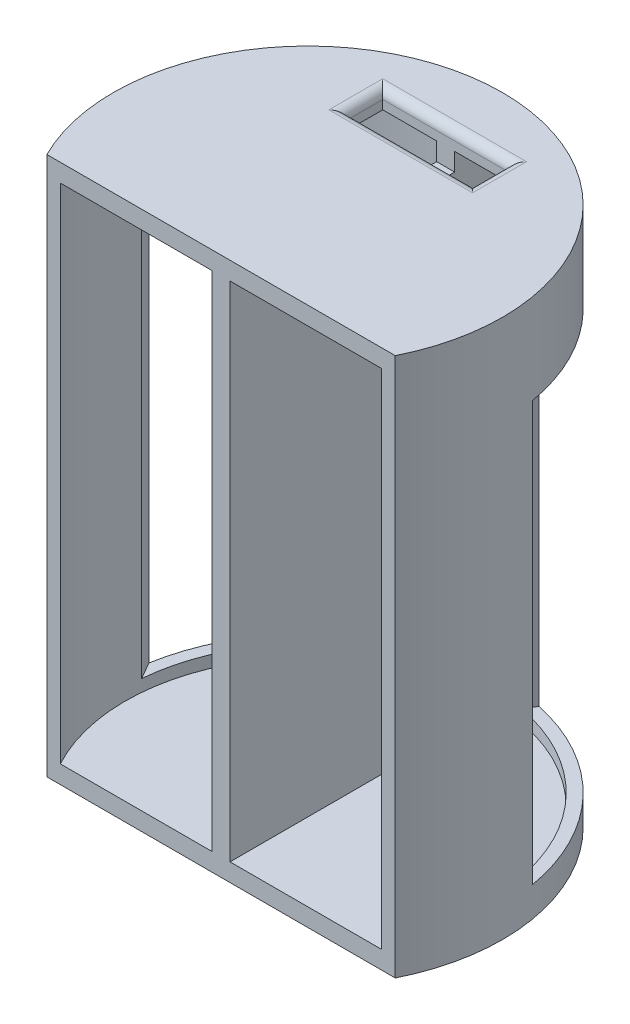
ISO-10303-21;
HEADER;
FILE_DESCRIPTION(('STEP AP214'),'2;1');
FILE_NAME('part.step','',(''),(''),'','','');
FILE_SCHEMA(('AUTOMOTIVE_DESIGN { 1 0 10303 214 1 1 1 1 }'));
ENDSEC;
DATA;
#1=APPLICATION_CONTEXT('core data for automotive mechanical design processes');
#2=APPLICATION_PROTOCOL_DEFINITION('international standard','automotive_design',2000,#1);
#3=PRODUCT_CONTEXT('',#1,'mechanical');
#4=PRODUCT('Part','Part','',(#3));
#5=PRODUCT_RELATED_PRODUCT_CATEGORY('part','',(#4));
#6=PRODUCT_DEFINITION_FORMATION('','',#4);
#7=PRODUCT_DEFINITION_CONTEXT('part definition',#1,'design');
#8=PRODUCT_DEFINITION('design','',#6,#7);
#9=PRODUCT_DEFINITION_SHAPE('','',#8);
#10=(LENGTH_UNIT() NAMED_UNIT(*) SI_UNIT(.MILLI.,.METRE.));
#11=(NAMED_UNIT(*) PLANE_ANGLE_UNIT() SI_UNIT($,.RADIAN.));
#12=(NAMED_UNIT(*) SI_UNIT($,.STERADIAN.) SOLID_ANGLE_UNIT());
#13=UNCERTAINTY_MEASURE_WITH_UNIT(LENGTH_MEASURE(1.E-05),#10,'distance_accuracy_value','');
#14=(GEOMETRIC_REPRESENTATION_CONTEXT(3) GLOBAL_UNCERTAINTY_ASSIGNED_CONTEXT((#13)) GLOBAL_UNIT_ASSIGNED_CONTEXT((#10,
#11,#12)) REPRESENTATION_CONTEXT('',''));
#15=CARTESIAN_POINT('',(0.,0.,0.));
#16=DIRECTION('',(0.,0.,1.));
#17=DIRECTION('',(1.,0.,0.));
#18=AXIS2_PLACEMENT_3D('',#15,#16,#17);
#19=CARTESIAN_POINT('',(0.,0.,0.));
#20=DIRECTION('',(0.,1.,0.));
#21=DIRECTION('',(0.,0.,1.));
#22=AXIS2_PLACEMENT_3D('',#19,#20,#21);
#23=PLANE('',#22);
#24=DIRECTION('',(0.,0.,-1.));
#25=VECTOR('',#24,1.);
#26=CARTESIAN_POINT('',(-11.,0.,-17.5));
#27=LINE('',#26,#25);
#28=CARTESIAN_POINT('',(-11.,0.,-23.5));
#29=VERTEX_POINT('',#28);
#30=CARTESIAN_POINT('',(-11.,0.,-16.5));
#31=VERTEX_POINT('',#30);
#32=EDGE_CURVE('E555',#29,#31,#27,.F.);
#33=ORIENTED_EDGE('',*,*,#32,.T.);
#34=DIRECTION('',(-1.,0.,0.));
#35=VECTOR('',#34,1.);
#36=CARTESIAN_POINT('',(10.,0.,-16.5));
#37=LINE('',#36,#35);
#38=CARTESIAN_POINT('',(11.,0.,-16.5));
#39=VERTEX_POINT('',#38);
#40=EDGE_CURVE('E561',#31,#39,#37,.F.);
#41=ORIENTED_EDGE('',*,*,#40,.T.);
#42=DIRECTION('',(0.,0.,1.));
#43=VECTOR('',#42,1.);
#44=CARTESIAN_POINT('',(11.,0.,-22.5));
#45=LINE('',#44,#43);
#46=CARTESIAN_POINT('',(11.,0.,-23.5));
#47=VERTEX_POINT('',#46);
#48=EDGE_CURVE('E558',#39,#47,#45,.F.);
#49=ORIENTED_EDGE('',*,*,#48,.T.);
#50=DIRECTION('',(1.,0.,0.));
#51=VECTOR('',#50,1.);
#52=CARTESIAN_POINT('',(-10.,0.,-23.5));
#53=LINE('',#52,#51);
#54=EDGE_CURVE('E552',#47,#29,#53,.F.);
#55=ORIENTED_EDGE('',*,*,#54,.T.);
#56=EDGE_LOOP('',(#33,#41,#49,#55));
#57=FACE_BOUND('',#56,.T.);
#58=CARTESIAN_POINT('',(0.,0.,0.));
#59=DIRECTION('',(0.,1.,0.));
#60=DIRECTION('',(0.,0.,1.));
#61=AXIS2_PLACEMENT_3D('',#58,#59,#60);
#62=CIRCLE('',#61,32.5);
#63=CARTESIAN_POINT('',(29.086079144498,0.,14.5));
#64=VERTEX_POINT('',#63);
#65=CARTESIAN_POINT('',(-29.086079144498,0.,14.5));
#66=VERTEX_POINT('',#65);
#67=EDGE_CURVE('E457',#64,#66,#62,.T.);
#68=ORIENTED_EDGE('',*,*,#67,.F.);
#69=DIRECTION('',(-1.,0.,0.));
#70=VECTOR('',#69,1.);
#71=CARTESIAN_POINT('',(-29.086079144498,0.,14.5));
#72=LINE('',#71,#70);
#73=EDGE_CURVE('E419',#64,#66,#72,.T.);
#74=ORIENTED_EDGE('',*,*,#73,.T.);
#75=EDGE_LOOP('',(#68,#74));
#76=FACE_BOUND('',#75,.T.);
#77=ADVANCED_FACE('F39',(#57,#76),#23,.F.);
#78=CARTESIAN_POINT('',(0.,87.,0.));
#79=DIRECTION('',(0.,1.,0.));
#80=DIRECTION('',(0.,0.,1.));
#81=AXIS2_PLACEMENT_3D('',#78,#79,#80);
#82=PLANE('',#81);
#83=DIRECTION('',(-1.,0.,0.));
#84=VECTOR('',#83,1.);
#85=CARTESIAN_POINT('',(0.,87.,-17.));
#86=LINE('',#85,#84);
#87=CARTESIAN_POINT('',(10.5,87.,-17.));
#88=VERTEX_POINT('',#87);
#89=CARTESIAN_POINT('',(1.49999999999998,87.,-17.));
#90=VERTEX_POINT('',#89);
#91=EDGE_CURVE('E320',#88,#90,#86,.T.);
#92=ORIENTED_EDGE('',*,*,#91,.F.);
#93=DIRECTION('',(0.,0.,1.));
#94=VECTOR('',#93,1.);
#95=CARTESIAN_POINT('',(10.5,87.,0.));
#96=LINE('',#95,#94);
#97=CARTESIAN_POINT('',(10.5,87.,-23.));
#98=VERTEX_POINT('',#97);
#99=EDGE_CURVE('E323',#98,#88,#96,.T.);
#100=ORIENTED_EDGE('',*,*,#99,.F.);
#101=DIRECTION('',(1.,0.,0.));
#102=VECTOR('',#101,1.);
#103=CARTESIAN_POINT('',(0.,87.,-23.));
#104=LINE('',#103,#102);
#105=CARTESIAN_POINT('',(1.49999999999998,87.,-23.));
#106=VERTEX_POINT('',#105);
#107=EDGE_CURVE('E308',#106,#98,#104,.T.);
#108=ORIENTED_EDGE('',*,*,#107,.F.);
#109=DIRECTION('',(0.,0.,1.));
#110=VECTOR('',#109,1.);
#111=CARTESIAN_POINT('',(1.49999999999998,87.,-32.502));
#112=LINE('',#111,#110);
#113=CARTESIAN_POINT('',(1.49999999999998,87.,-30.4630924234556));
#114=VERTEX_POINT('',#113);
#115=EDGE_CURVE('E334',#114,#106,#112,.T.);
#116=ORIENTED_EDGE('',*,*,#115,.F.);
#117=CARTESIAN_POINT('',(0.,87.,0.));
#118=DIRECTION('',(0.,1.,0.));
#119=DIRECTION('',(0.,0.,1.));
#120=AXIS2_PLACEMENT_3D('',#117,#118,#119);
#121=CIRCLE('',#120,30.5);
#122=CARTESIAN_POINT('',(26.8328157299975,87.,14.5));
#123=VERTEX_POINT('',#122);
#124=EDGE_CURVE('E461',#123,#114,#121,.T.);
#125=ORIENTED_EDGE('',*,*,#124,.F.);
#126=DIRECTION('',(-1.,0.,0.));
#127=VECTOR('',#126,1.);
#128=CARTESIAN_POINT('',(0.,87.,14.5));
#129=LINE('',#128,#127);
#130=CARTESIAN_POINT('',(1.5,87.,14.5));
#131=VERTEX_POINT('',#130);
#132=EDGE_CURVE('E439',#123,#131,#129,.T.);
#133=ORIENTED_EDGE('',*,*,#132,.T.);
#134=EDGE_CURVE('E339',#90,#131,#112,.T.);
#135=ORIENTED_EDGE('',*,*,#134,.F.);
#136=EDGE_LOOP('',(#92,#100,#108,#116,#125,#133,#135));
#137=FACE_BOUND('',#136,.T.);
#138=ADVANCED_FACE('F622',(#137),#82,.F.);
#139=CARTESIAN_POINT('',(0.,90.,0.));
#140=DIRECTION('',(0.,1.,0.));
#141=DIRECTION('',(0.,0.,1.));
#142=AXIS2_PLACEMENT_3D('',#139,#140,#141);
#143=PLANE('',#142);
#144=DIRECTION('',(0.,0.,1.));
#145=VECTOR('',#144,1.);
#146=CARTESIAN_POINT('',(12.,90.,0.));
#147=LINE('',#146,#145);
#148=CARTESIAN_POINT('',(12.,90.,-24.5));
#149=VERTEX_POINT('',#148);
#150=CARTESIAN_POINT('',(12.,90.,-15.5));
#151=VERTEX_POINT('',#150);
#152=EDGE_CURVE('E519',#149,#151,#147,.T.);
#153=ORIENTED_EDGE('',*,*,#152,.T.);
#154=DIRECTION('',(-1.,0.,0.));
#155=VECTOR('',#154,1.);
#156=CARTESIAN_POINT('',(0.,90.,-15.5));
#157=LINE('',#156,#155);
#158=CARTESIAN_POINT('',(-12.,90.,-15.5));
#159=VERTEX_POINT('',#158);
#160=EDGE_CURVE('E522',#151,#159,#157,.T.);
#161=ORIENTED_EDGE('',*,*,#160,.T.);
#162=DIRECTION('',(0.,0.,-1.));
#163=VECTOR('',#162,1.);
#164=CARTESIAN_POINT('',(-12.,90.,0.));
#165=LINE('',#164,#163);
#166=CARTESIAN_POINT('',(-12.,90.,-24.5));
#167=VERTEX_POINT('',#166);
#168=EDGE_CURVE('E516',#159,#167,#165,.T.);
#169=ORIENTED_EDGE('',*,*,#168,.T.);
#170=DIRECTION('',(1.,0.,0.));
#171=VECTOR('',#170,1.);
#172=CARTESIAN_POINT('',(0.,90.,-24.5));
#173=LINE('',#172,#171);
#174=EDGE_CURVE('E513',#167,#149,#173,.T.);
#175=ORIENTED_EDGE('',*,*,#174,.T.);
#176=EDGE_LOOP('',(#153,#161,#169,#175));
#177=FACE_BOUND('',#176,.T.);
#178=DIRECTION('',(-1.,0.,0.));
#179=VECTOR('',#178,1.);
#180=CARTESIAN_POINT('',(0.,90.,14.5));
#181=LINE('',#180,#179);
#182=CARTESIAN_POINT('',(29.086079144498,90.,14.5));
#183=VERTEX_POINT('',#182);
#184=CARTESIAN_POINT('',(-29.086079144498,90.,14.5));
#185=VERTEX_POINT('',#184);
#186=EDGE_CURVE('E443',#183,#185,#181,.T.);
#187=ORIENTED_EDGE('',*,*,#186,.F.);
#188=CARTESIAN_POINT('',(0.,90.,0.));
#189=DIRECTION('',(0.,1.,0.));
#190=DIRECTION('',(0.,0.,1.));
#191=AXIS2_PLACEMENT_3D('',#188,#189,#190);
#192=CIRCLE('',#191,32.5);
#193=EDGE_CURVE('E452',#183,#185,#192,.T.);
#194=ORIENTED_EDGE('',*,*,#193,.T.);
#195=EDGE_LOOP('',(#187,#194));
#196=FACE_BOUND('',#195,.T.);
#197=ADVANCED_FACE('F627',(#177,#196),#143,.T.);
#198=DIRECTION('',(-1.,0.,0.));
#199=VECTOR('',#198,1.);
#200=CARTESIAN_POINT('',(0.,87.,-17.));
#201=LINE('',#200,#199);
#202=CARTESIAN_POINT('',(-1.50000000000001,87.,-17.));
#203=VERTEX_POINT('',#202);
#204=CARTESIAN_POINT('',(-10.5,87.,-17.));
#205=VERTEX_POINT('',#204);
#206=EDGE_CURVE('E312',#203,#205,#201,.T.);
#207=ORIENTED_EDGE('',*,*,#206,.F.);
#208=DIRECTION('',(0.,0.,-1.));
#209=VECTOR('',#208,1.);
#210=CARTESIAN_POINT('',(-1.50000000000001,87.,-32.502));
#211=LINE('',#210,#209);
#212=CARTESIAN_POINT('',(-1.50000000000001,87.,14.5));
#213=VERTEX_POINT('',#212);
#214=EDGE_CURVE('E328',#213,#203,#211,.T.);
#215=ORIENTED_EDGE('',*,*,#214,.F.);
#216=CARTESIAN_POINT('',(-26.8328157299975,87.,14.5));
#217=VERTEX_POINT('',#216);
#218=EDGE_CURVE('E438',#213,#217,#129,.T.);
#219=ORIENTED_EDGE('',*,*,#218,.T.);
#220=CARTESIAN_POINT('',(-1.50000000000001,87.,-30.4630924234556));
#221=VERTEX_POINT('',#220);
#222=EDGE_CURVE('E451',#221,#217,#121,.T.);
#223=ORIENTED_EDGE('',*,*,#222,.F.);
#224=CARTESIAN_POINT('',(-1.50000000000001,87.,-23.));
#225=VERTEX_POINT('',#224);
#226=EDGE_CURVE('E333',#225,#221,#211,.T.);
#227=ORIENTED_EDGE('',*,*,#226,.F.);
#228=DIRECTION('',(1.,0.,0.));
#229=VECTOR('',#228,1.);
#230=CARTESIAN_POINT('',(0.,87.,-23.));
#231=LINE('',#230,#229);
#232=CARTESIAN_POINT('',(-10.5,87.,-23.));
#233=VERTEX_POINT('',#232);
#234=EDGE_CURVE('E301',#233,#225,#231,.T.);
#235=ORIENTED_EDGE('',*,*,#234,.F.);
#236=DIRECTION('',(0.,0.,-1.));
#237=VECTOR('',#236,1.);
#238=CARTESIAN_POINT('',(-10.5,87.,0.));
#239=LINE('',#238,#237);
#240=EDGE_CURVE('E509',#205,#233,#239,.T.);
#241=ORIENTED_EDGE('',*,*,#240,.F.);
#242=EDGE_LOOP('',(#207,#215,#219,#223,#227,#235,#241));
#243=FACE_BOUND('',#242,.T.);
#244=ADVANCED_FACE('F630',(#243),#82,.F.);
#245=CARTESIAN_POINT('',(1.49999999999998,90.,-32.502));
#246=DIRECTION('',(1.,0.,0.));
#247=DIRECTION('',(0.,1.,0.));
#248=AXIS2_PLACEMENT_3D('',#245,#246,#247);
#249=PLANE('',#248);
#250=DIRECTION('',(0.,0.,1.));
#251=VECTOR('',#250,1.);
#252=CARTESIAN_POINT('',(1.49999999999998,84.,-32.502));
#253=LINE('',#252,#251);
#254=CARTESIAN_POINT('',(1.49999999999997,84.,-23.));
#255=VERTEX_POINT('',#254);
#256=CARTESIAN_POINT('',(1.49999999999998,84.,-17.));
#257=VERTEX_POINT('',#256);
#258=EDGE_CURVE('E297',#255,#257,#253,.T.);
#259=ORIENTED_EDGE('',*,*,#258,.T.);
#260=DIRECTION('',(0.,1.,0.));
#261=VECTOR('',#260,1.);
#262=CARTESIAN_POINT('',(1.49999999999998,90.,-17.));
#263=LINE('',#262,#261);
#264=EDGE_CURVE('E316',#257,#90,#263,.T.);
#265=ORIENTED_EDGE('',*,*,#264,.T.);
#266=ORIENTED_EDGE('',*,*,#134,.T.);
#267=DIRECTION('',(0.,1.,0.));
#268=VECTOR('',#267,1.);
#269=CARTESIAN_POINT('',(1.49999999999998,90.,14.5));
#270=LINE('',#269,#268);
#271=CARTESIAN_POINT('',(1.5,3.00000000000003,14.5));
#272=VERTEX_POINT('',#271);
#273=EDGE_CURVE('E346',#272,#131,#270,.T.);
#274=ORIENTED_EDGE('',*,*,#273,.F.);
#275=DIRECTION('',(0.,0.,-1.));
#276=VECTOR('',#275,1.);
#277=CARTESIAN_POINT('',(1.5,3.,-32.502));
#278=LINE('',#277,#276);
#279=CARTESIAN_POINT('',(1.5,3.,-30.4630924234556));
#280=VERTEX_POINT('',#279);
#281=EDGE_CURVE('E338',#272,#280,#278,.T.);
#282=ORIENTED_EDGE('',*,*,#281,.T.);
#283=DIRECTION('',(0.,-1.,0.));
#284=VECTOR('',#283,1.);
#285=CARTESIAN_POINT('',(1.49999999999998,90.,-30.4630924234556));
#286=LINE('',#285,#284);
#287=EDGE_CURVE('E327',#114,#280,#286,.T.);
#288=ORIENTED_EDGE('',*,*,#287,.F.);
#289=ORIENTED_EDGE('',*,*,#115,.T.);
#290=DIRECTION('',(0.,-1.,0.));
#291=VECTOR('',#290,1.);
#292=CARTESIAN_POINT('',(1.49999999999998,90.,-23.));
#293=LINE('',#292,#291);
#294=EDGE_CURVE('E304',#106,#255,#293,.T.);
#295=ORIENTED_EDGE('',*,*,#294,.T.);
#296=EDGE_LOOP('',(#259,#265,#266,#274,#282,#288,#289,#295));
#297=FACE_BOUND('',#296,.T.);
#298=ADVANCED_FACE('F814',(#297),#249,.T.);
#299=CARTESIAN_POINT('',(-1.50000000000001,90.,-32.502));
#300=DIRECTION('',(-1.,0.,0.));
#301=DIRECTION('',(0.,-1.,0.));
#302=AXIS2_PLACEMENT_3D('',#299,#300,#301);
#303=PLANE('',#302);
#304=ORIENTED_EDGE('',*,*,#214,.T.);
#305=DIRECTION('',(0.,-1.,0.));
#306=VECTOR('',#305,1.);
#307=CARTESIAN_POINT('',(-1.50000000000001,90.,-17.));
#308=LINE('',#307,#306);
#309=CARTESIAN_POINT('',(-1.50000000000001,84.,-17.));
#310=VERTEX_POINT('',#309);
#311=EDGE_CURVE('E505',#203,#310,#308,.T.);
#312=ORIENTED_EDGE('',*,*,#311,.T.);
#313=DIRECTION('',(0.,0.,-1.));
#314=VECTOR('',#313,1.);
#315=CARTESIAN_POINT('',(-1.50000000000001,84.,-32.502));
#316=LINE('',#315,#314);
#317=CARTESIAN_POINT('',(-1.50000000000001,84.,-23.));
#318=VERTEX_POINT('',#317);
#319=EDGE_CURVE('E497',#310,#318,#316,.T.);
#320=ORIENTED_EDGE('',*,*,#319,.T.);
#321=DIRECTION('',(0.,1.,0.));
#322=VECTOR('',#321,1.);
#323=CARTESIAN_POINT('',(-1.50000000000001,90.,-23.));
#324=LINE('',#323,#322);
#325=EDGE_CURVE('E501',#318,#225,#324,.T.);
#326=ORIENTED_EDGE('',*,*,#325,.T.);
#327=ORIENTED_EDGE('',*,*,#226,.T.);
#328=DIRECTION('',(0.,-1.,0.));
#329=VECTOR('',#328,1.);
#330=CARTESIAN_POINT('',(-1.50000000000001,90.,-30.4630924234556));
#331=LINE('',#330,#329);
#332=CARTESIAN_POINT('',(-1.5,3.,-30.4630924234556));
#333=VERTEX_POINT('',#332);
#334=EDGE_CURVE('E355',#333,#221,#331,.F.);
#335=ORIENTED_EDGE('',*,*,#334,.F.);
#336=DIRECTION('',(0.,0.,1.));
#337=VECTOR('',#336,1.);
#338=CARTESIAN_POINT('',(-1.5,3.,-32.502));
#339=LINE('',#338,#337);
#340=CARTESIAN_POINT('',(-1.50000000000001,3.,14.5));
#341=VERTEX_POINT('',#340);
#342=EDGE_CURVE('E332',#333,#341,#339,.T.);
#343=ORIENTED_EDGE('',*,*,#342,.T.);
#344=DIRECTION('',(0.,-1.,0.));
#345=VECTOR('',#344,1.);
#346=CARTESIAN_POINT('',(-1.50000000000001,90.,14.5));
#347=LINE('',#346,#345);
#348=EDGE_CURVE('E347',#213,#341,#347,.T.);
#349=ORIENTED_EDGE('',*,*,#348,.F.);
#350=EDGE_LOOP('',(#304,#312,#320,#326,#327,#335,#343,#349));
#351=FACE_BOUND('',#350,.T.);
#352=ADVANCED_FACE('F820',(#351),#303,.T.);
#353=CARTESIAN_POINT('',(0.,90.,0.));
#354=DIRECTION('',(0.,-1.,0.));
#355=DIRECTION('',(0.,0.,-1.));
#356=AXIS2_PLACEMENT_3D('',#353,#354,#355);
#357=CYLINDRICAL_SURFACE('',#356,30.5);
#358=ORIENTED_EDGE('',*,*,#287,.T.);
#359=CARTESIAN_POINT('',(0.,3.,0.));
#360=DIRECTION('',(0.,-1.,0.));
#361=DIRECTION('',(0.,0.,-1.));
#362=AXIS2_PLACEMENT_3D('',#359,#360,#361);
#363=CIRCLE('',#362,30.5);
#364=CARTESIAN_POINT('',(26.8328157299975,3.,14.5));
#365=VERTEX_POINT('',#364);
#366=EDGE_CURVE('E446',#280,#365,#363,.T.);
#367=ORIENTED_EDGE('',*,*,#366,.T.);
#368=DIRECTION('',(0.,-1.,0.));
#369=VECTOR('',#368,1.);
#370=CARTESIAN_POINT('',(26.8328157299975,90.,14.5));
#371=LINE('',#370,#369);
#372=EDGE_CURVE('E434',#123,#365,#371,.T.);
#373=ORIENTED_EDGE('',*,*,#372,.F.);
#374=ORIENTED_EDGE('',*,*,#124,.T.);
#375=EDGE_LOOP('',(#358,#367,#373,#374));
#376=FACE_BOUND('',#375,.T.);
#377=CARTESIAN_POINT('',(0.,4.99999999999999,0.));
#378=DIRECTION('',(0.,-1.,0.));
#379=DIRECTION('',(1.,0.,0.));
#380=AXIS2_PLACEMENT_3D('',#377,#378,#379);
#381=CIRCLE('',#380,30.5);
#382=CARTESIAN_POINT('',(5.74677549637944,5.,-29.9537071394212));
#383=VERTEX_POINT('',#382);
#384=CARTESIAN_POINT('',(30.386337699439,5.,-2.63068075137406));
#385=VERTEX_POINT('',#384);
#386=EDGE_CURVE('E478',#383,#385,#381,.T.);
#387=ORIENTED_EDGE('',*,*,#386,.F.);
#388=DIRECTION('',(0.,-1.,0.));
#389=VECTOR('',#388,1.);
#390=CARTESIAN_POINT('',(5.74677549637946,90.,-29.9537071394212));
#391=LINE('',#390,#389);
#392=CARTESIAN_POINT('',(5.74677549637946,75.,-29.9537071394212));
#393=VERTEX_POINT('',#392);
#394=EDGE_CURVE('E468',#393,#383,#391,.T.);
#395=ORIENTED_EDGE('',*,*,#394,.F.);
#396=CARTESIAN_POINT('',(0.,75.,0.));
#397=DIRECTION('',(0.,1.,0.));
#398=DIRECTION('',(0.,0.,1.));
#399=AXIS2_PLACEMENT_3D('',#396,#397,#398);
#400=CIRCLE('',#399,30.5);
#401=CARTESIAN_POINT('',(30.386337699439,75.,-2.63068075137407));
#402=VERTEX_POINT('',#401);
#403=EDGE_CURVE('E471',#402,#393,#400,.T.);
#404=ORIENTED_EDGE('',*,*,#403,.F.);
#405=DIRECTION('',(0.,-1.,0.));
#406=VECTOR('',#405,1.);
#407=CARTESIAN_POINT('',(30.386337699439,90.,-2.63068075137407));
#408=LINE('',#407,#406);
#409=EDGE_CURVE('E475',#385,#402,#408,.F.);
#410=ORIENTED_EDGE('',*,*,#409,.F.);
#411=EDGE_LOOP('',(#387,#395,#404,#410));
#412=FACE_BOUND('',#411,.T.);
#413=ADVANCED_FACE('F827',(#376,#412),#357,.F.);
#414=CARTESIAN_POINT('',(0.,3.,0.));
#415=DIRECTION('',(0.,-1.,0.));
#416=DIRECTION('',(0.,0.,-1.));
#417=AXIS2_PLACEMENT_3D('',#414,#415,#416);
#418=PLANE('',#417);
#419=ORIENTED_EDGE('',*,*,#366,.F.);
#420=ORIENTED_EDGE('',*,*,#281,.F.);
#421=DIRECTION('',(1.,0.,0.));
#422=VECTOR('',#421,1.);
#423=CARTESIAN_POINT('',(0.,3.,14.5));
#424=LINE('',#423,#422);
#425=EDGE_CURVE('E456',#272,#365,#424,.T.);
#426=ORIENTED_EDGE('',*,*,#425,.T.);
#427=EDGE_LOOP('',(#419,#420,#426));
#428=FACE_BOUND('',#427,.T.);
#429=ADVANCED_FACE('F638',(#428),#418,.F.);
#430=CARTESIAN_POINT('',(0.,90.,0.));
#431=DIRECTION('',(0.,-1.,0.));
#432=DIRECTION('',(0.,0.,-1.));
#433=AXIS2_PLACEMENT_3D('',#430,#431,#432);
#434=CYLINDRICAL_SURFACE('',#433,32.5);
#435=ORIENTED_EDGE('',*,*,#67,.T.);
#436=DIRECTION('',(0.,1.,0.));
#437=VECTOR('',#436,1.);
#438=CARTESIAN_POINT('',(-29.086079144498,0.,14.5));
#439=LINE('',#438,#437);
#440=EDGE_CURVE('E424',#66,#185,#439,.T.);
#441=ORIENTED_EDGE('',*,*,#440,.T.);
#442=ORIENTED_EDGE('',*,*,#193,.F.);
#443=DIRECTION('',(0.,1.,0.));
#444=VECTOR('',#443,1.);
#445=CARTESIAN_POINT('',(29.086079144498,0.,14.5));
#446=LINE('',#445,#444);
#447=EDGE_CURVE('E423',#64,#183,#446,.T.);
#448=ORIENTED_EDGE('',*,*,#447,.F.);
#449=EDGE_LOOP('',(#435,#441,#442,#448));
#450=FACE_BOUND('',#449,.T.);
#451=DIRECTION('',(0.,-1.,0.));
#452=VECTOR('',#451,1.);
#453=CARTESIAN_POINT('',(6.80139205822177,90.,-31.7803566070357));
#454=LINE('',#453,#452);
#455=CARTESIAN_POINT('',(6.80139205822177,75.,-31.7803566070357));
#456=VERTEX_POINT('',#455);
#457=CARTESIAN_POINT('',(6.80139205822177,5.,-31.7803566070357));
#458=VERTEX_POINT('',#457);
#459=EDGE_CURVE('E393',#456,#458,#454,.T.);
#460=ORIENTED_EDGE('',*,*,#459,.T.);
#461=CARTESIAN_POINT('',(0.,4.99999999999999,0.));
#462=DIRECTION('',(0.,-1.,0.));
#463=DIRECTION('',(1.,0.,0.));
#464=AXIS2_PLACEMENT_3D('',#461,#462,#463);
#465=CIRCLE('',#464,32.5);
#466=CARTESIAN_POINT('',(32.0339149232585,5.,-5.48436821242277));
#467=VERTEX_POINT('',#466);
#468=EDGE_CURVE('E415',#458,#467,#465,.T.);
#469=ORIENTED_EDGE('',*,*,#468,.T.);
#470=DIRECTION('',(0.,-1.,0.));
#471=VECTOR('',#470,1.);
#472=CARTESIAN_POINT('',(32.0339149232585,90.,-5.48436821242276));
#473=LINE('',#472,#471);
#474=CARTESIAN_POINT('',(32.0339149232585,75.,-5.48436821242276));
#475=VERTEX_POINT('',#474);
#476=EDGE_CURVE('E411',#467,#475,#473,.F.);
#477=ORIENTED_EDGE('',*,*,#476,.T.);
#478=CARTESIAN_POINT('',(0.,75.,0.));
#479=DIRECTION('',(0.,1.,0.));
#480=DIRECTION('',(0.,0.,1.));
#481=AXIS2_PLACEMENT_3D('',#478,#479,#480);
#482=CIRCLE('',#481,32.5);
#483=EDGE_CURVE('E407',#475,#456,#482,.T.);
#484=ORIENTED_EDGE('',*,*,#483,.T.);
#485=EDGE_LOOP('',(#460,#469,#477,#484));
#486=FACE_BOUND('',#485,.T.);
#487=CARTESIAN_POINT('',(0.,4.99999999999999,0.));
#488=DIRECTION('',(0.,1.,0.));
#489=DIRECTION('',(-1.,0.,0.));
#490=AXIS2_PLACEMENT_3D('',#487,#488,#489);
#491=CIRCLE('',#490,32.5);
#492=CARTESIAN_POINT('',(-6.80139205822176,5.,-31.7803566070357));
#493=VERTEX_POINT('',#492);
#494=CARTESIAN_POINT('',(-32.0339149232585,5.,-5.48436821242276));
#495=VERTEX_POINT('',#494);
#496=EDGE_CURVE('E384',#493,#495,#491,.T.);
#497=ORIENTED_EDGE('',*,*,#496,.F.);
#498=DIRECTION('',(0.,-1.,0.));
#499=VECTOR('',#498,1.);
#500=CARTESIAN_POINT('',(-6.80139205822177,90.,-31.7803566070357));
#501=LINE('',#500,#499);
#502=CARTESIAN_POINT('',(-6.80139205822177,75.,-31.7803566070357));
#503=VERTEX_POINT('',#502);
#504=EDGE_CURVE('E381',#503,#493,#501,.T.);
#505=ORIENTED_EDGE('',*,*,#504,.F.);
#506=CARTESIAN_POINT('',(0.,75.,0.));
#507=DIRECTION('',(0.,-1.,0.));
#508=DIRECTION('',(0.,0.,-1.));
#509=AXIS2_PLACEMENT_3D('',#506,#507,#508);
#510=CIRCLE('',#509,32.5);
#511=CARTESIAN_POINT('',(-32.0339149232585,75.,-5.48436821242276));
#512=VERTEX_POINT('',#511);
#513=EDGE_CURVE('E378',#512,#503,#510,.T.);
#514=ORIENTED_EDGE('',*,*,#513,.F.);
#515=DIRECTION('',(0.,-1.,0.));
#516=VECTOR('',#515,1.);
#517=CARTESIAN_POINT('',(-32.0339149232585,90.,-5.48436821242276));
#518=LINE('',#517,#516);
#519=EDGE_CURVE('E365',#495,#512,#518,.F.);
#520=ORIENTED_EDGE('',*,*,#519,.F.);
#521=EDGE_LOOP('',(#497,#505,#514,#520));
#522=FACE_BOUND('',#521,.T.);
#523=ADVANCED_FACE('F634',(#450,#486,#522),#434,.T.);
#524=ORIENTED_EDGE('',*,*,#334,.T.);
#525=ORIENTED_EDGE('',*,*,#222,.T.);
#526=DIRECTION('',(0.,-1.,0.));
#527=VECTOR('',#526,1.);
#528=CARTESIAN_POINT('',(-26.8328157299975,90.,14.5));
#529=LINE('',#528,#527);
#530=CARTESIAN_POINT('',(-26.8328157299975,3.,14.5));
#531=VERTEX_POINT('',#530);
#532=EDGE_CURVE('E428',#531,#217,#529,.F.);
#533=ORIENTED_EDGE('',*,*,#532,.F.);
#534=EDGE_CURVE('E447',#531,#333,#363,.T.);
#535=ORIENTED_EDGE('',*,*,#534,.T.);
#536=EDGE_LOOP('',(#524,#525,#533,#535));
#537=FACE_BOUND('',#536,.T.);
#538=DIRECTION('',(0.,-1.,0.));
#539=VECTOR('',#538,1.);
#540=CARTESIAN_POINT('',(-5.74677549637946,90.,-29.9537071394212));
#541=LINE('',#540,#539);
#542=CARTESIAN_POINT('',(-5.74677549637946,75.,-29.9537071394212));
#543=VERTEX_POINT('',#542);
#544=CARTESIAN_POINT('',(-5.74677549637944,5.,-29.9537071394212));
#545=VERTEX_POINT('',#544);
#546=EDGE_CURVE('E489',#543,#545,#541,.T.);
#547=ORIENTED_EDGE('',*,*,#546,.T.);
#548=CARTESIAN_POINT('',(0.,4.99999999999999,0.));
#549=DIRECTION('',(0.,1.,0.));
#550=DIRECTION('',(-1.,0.,0.));
#551=AXIS2_PLACEMENT_3D('',#548,#549,#550);
#552=CIRCLE('',#551,30.5);
#553=CARTESIAN_POINT('',(-30.386337699439,5.,-2.63068075137406));
#554=VERTEX_POINT('',#553);
#555=EDGE_CURVE('E493',#545,#554,#552,.T.);
#556=ORIENTED_EDGE('',*,*,#555,.T.);
#557=DIRECTION('',(0.,-1.,0.));
#558=VECTOR('',#557,1.);
#559=CARTESIAN_POINT('',(-30.386337699439,90.,-2.63068075137407));
#560=LINE('',#559,#558);
#561=CARTESIAN_POINT('',(-30.386337699439,75.,-2.63068075137407));
#562=VERTEX_POINT('',#561);
#563=EDGE_CURVE('E481',#554,#562,#560,.F.);
#564=ORIENTED_EDGE('',*,*,#563,.T.);
#565=CARTESIAN_POINT('',(0.,75.,0.));
#566=DIRECTION('',(0.,-1.,0.));
#567=DIRECTION('',(0.,0.,-1.));
#568=AXIS2_PLACEMENT_3D('',#565,#566,#567);
#569=CIRCLE('',#568,30.5);
#570=EDGE_CURVE('E485',#562,#543,#569,.T.);
#571=ORIENTED_EDGE('',*,*,#570,.T.);
#572=EDGE_LOOP('',(#547,#556,#564,#571));
#573=FACE_BOUND('',#572,.T.);
#574=ADVANCED_FACE('F637',(#537,#573),#357,.F.);
#575=CARTESIAN_POINT('',(-29.086079144498,0.,14.5));
#576=DIRECTION('',(0.,0.,-1.));
#577=DIRECTION('',(-1.,0.,0.));
#578=AXIS2_PLACEMENT_3D('',#575,#576,#577);
#579=PLANE('',#578);
#580=ORIENTED_EDGE('',*,*,#218,.F.);
#581=ORIENTED_EDGE('',*,*,#348,.T.);
#582=EDGE_CURVE('E465',#531,#341,#424,.T.);
#583=ORIENTED_EDGE('',*,*,#582,.F.);
#584=ORIENTED_EDGE('',*,*,#532,.T.);
#585=EDGE_LOOP('',(#580,#581,#583,#584));
#586=FACE_BOUND('',#585,.T.);
#587=ORIENTED_EDGE('',*,*,#186,.T.);
#588=ORIENTED_EDGE('',*,*,#440,.F.);
#589=ORIENTED_EDGE('',*,*,#73,.F.);
#590=ORIENTED_EDGE('',*,*,#447,.T.);
#591=EDGE_LOOP('',(#587,#588,#589,#590));
#592=FACE_BOUND('',#591,.T.);
#593=ORIENTED_EDGE('',*,*,#372,.T.);
#594=ORIENTED_EDGE('',*,*,#425,.F.);
#595=ORIENTED_EDGE('',*,*,#273,.T.);
#596=ORIENTED_EDGE('',*,*,#132,.F.);
#597=EDGE_LOOP('',(#593,#594,#595,#596));
#598=FACE_BOUND('',#597,.T.);
#599=ADVANCED_FACE('F856',(#586,#592,#598),#579,.F.);
#600=ORIENTED_EDGE('',*,*,#582,.T.);
#601=ORIENTED_EDGE('',*,*,#342,.F.);
#602=ORIENTED_EDGE('',*,*,#534,.F.);
#603=EDGE_LOOP('',(#600,#601,#602));
#604=FACE_BOUND('',#603,.T.);
#605=ADVANCED_FACE('F843',(#604),#418,.F.);
#606=CARTESIAN_POINT('',(7.2469509171739,5.,37.4479128114971));
#607=DIRECTION('',(0.,-1.,0.));
#608=DIRECTION('',(1.,0.,0.));
#609=AXIS2_PLACEMENT_3D('',#606,#607,#608);
#610=PLANE('',#609);
#611=DIRECTION('',(0.499999999999998,0.,-0.86602540378444));
#612=VECTOR('',#611,1.);
#613=CARTESIAN_POINT('',(-23.0639382152815,5.,19.9479128114971));
#614=LINE('',#613,#612);
#615=EDGE_CURVE('E388',#383,#458,#614,.T.);
#616=ORIENTED_EDGE('',*,*,#615,.F.);
#617=ORIENTED_EDGE('',*,*,#386,.T.);
#618=DIRECTION('',(0.499999999999998,0.,-0.86602540378444));
#619=VECTOR('',#618,1.);
#620=CARTESIAN_POINT('',(7.2469509171739,5.,37.4479128114971));
#621=LINE('',#620,#619);
#622=EDGE_CURVE('E389',#385,#467,#621,.T.);
#623=ORIENTED_EDGE('',*,*,#622,.T.);
#624=ORIENTED_EDGE('',*,*,#468,.F.);
#625=EDGE_LOOP('',(#616,#617,#623,#624));
#626=FACE_BOUND('',#625,.T.);
#627=ADVANCED_FACE('F869',(#626),#610,.F.);
#628=CARTESIAN_POINT('',(7.2469509171739,5.,37.4479128114971));
#629=DIRECTION('',(0.86602540378444,0.,0.499999999999998));
#630=DIRECTION('',(0.499999999999998,0.,-0.86602540378444));
#631=AXIS2_PLACEMENT_3D('',#628,#629,#630);
#632=PLANE('',#631);
#633=ORIENTED_EDGE('',*,*,#622,.F.);
#634=ORIENTED_EDGE('',*,*,#409,.T.);
#635=DIRECTION('',(0.499999999999998,0.,-0.86602540378444));
#636=VECTOR('',#635,1.);
#637=CARTESIAN_POINT('',(7.2469509171739,75.,37.4479128114971));
#638=LINE('',#637,#636);
#639=EDGE_CURVE('E394',#402,#475,#638,.T.);
#640=ORIENTED_EDGE('',*,*,#639,.T.);
#641=ORIENTED_EDGE('',*,*,#476,.F.);
#642=EDGE_LOOP('',(#633,#634,#640,#641));
#643=FACE_BOUND('',#642,.T.);
#644=ADVANCED_FACE('F876',(#643),#632,.F.);
#645=CARTESIAN_POINT('',(7.2469509171739,75.,37.4479128114971));
#646=DIRECTION('',(0.,1.,0.));
#647=DIRECTION('',(0.,0.,1.));
#648=AXIS2_PLACEMENT_3D('',#645,#646,#647);
#649=PLANE('',#648);
#650=ORIENTED_EDGE('',*,*,#639,.F.);
#651=ORIENTED_EDGE('',*,*,#403,.T.);
#652=DIRECTION('',(0.499999999999998,0.,-0.86602540378444));
#653=VECTOR('',#652,1.);
#654=CARTESIAN_POINT('',(-23.0639382152815,75.,19.9479128114972));
#655=LINE('',#654,#653);
#656=EDGE_CURVE('E398',#393,#456,#655,.T.);
#657=ORIENTED_EDGE('',*,*,#656,.T.);
#658=ORIENTED_EDGE('',*,*,#483,.F.);
#659=EDGE_LOOP('',(#650,#651,#657,#658));
#660=FACE_BOUND('',#659,.T.);
#661=ADVANCED_FACE('F884',(#660),#649,.F.);
#662=CARTESIAN_POINT('',(-23.0639382152815,5.,19.9479128114971));
#663=DIRECTION('',(-0.86602540378444,0.,-0.499999999999998));
#664=DIRECTION('',(-0.499999999999998,0.,0.86602540378444));
#665=AXIS2_PLACEMENT_3D('',#662,#663,#664);
#666=PLANE('',#665);
#667=ORIENTED_EDGE('',*,*,#656,.F.);
#668=ORIENTED_EDGE('',*,*,#394,.T.);
#669=ORIENTED_EDGE('',*,*,#615,.T.);
#670=ORIENTED_EDGE('',*,*,#459,.F.);
#671=EDGE_LOOP('',(#667,#668,#669,#670));
#672=FACE_BOUND('',#671,.T.);
#673=ADVANCED_FACE('F892',(#672),#666,.F.);
#674=CARTESIAN_POINT('',(-7.2469509171739,5.,37.4479128114971));
#675=DIRECTION('',(0.,1.,0.));
#676=DIRECTION('',(-1.,0.,0.));
#677=AXIS2_PLACEMENT_3D('',#674,#675,#676);
#678=PLANE('',#677);
#679=ORIENTED_EDGE('',*,*,#496,.T.);
#680=DIRECTION('',(-0.499999999999998,0.,-0.86602540378444));
#681=VECTOR('',#680,1.);
#682=CARTESIAN_POINT('',(-7.2469509171739,5.,37.4479128114971));
#683=LINE('',#682,#681);
#684=EDGE_CURVE('E351',#554,#495,#683,.T.);
#685=ORIENTED_EDGE('',*,*,#684,.F.);
#686=ORIENTED_EDGE('',*,*,#555,.F.);
#687=DIRECTION('',(-0.499999999999998,0.,-0.86602540378444));
#688=VECTOR('',#687,1.);
#689=CARTESIAN_POINT('',(23.0639382152815,5.,19.9479128114971));
#690=LINE('',#689,#688);
#691=EDGE_CURVE('E361',#545,#493,#690,.T.);
#692=ORIENTED_EDGE('',*,*,#691,.T.);
#693=EDGE_LOOP('',(#679,#685,#686,#692));
#694=FACE_BOUND('',#693,.T.);
#695=ADVANCED_FACE('F899',(#694),#678,.T.);
#696=CARTESIAN_POINT('',(23.0639382152815,5.,19.9479128114971));
#697=DIRECTION('',(-0.86602540378444,0.,0.499999999999998));
#698=DIRECTION('',(0.499999999999998,0.,0.86602540378444));
#699=AXIS2_PLACEMENT_3D('',#696,#697,#698);
#700=PLANE('',#699);
#701=ORIENTED_EDGE('',*,*,#504,.T.);
#702=ORIENTED_EDGE('',*,*,#691,.F.);
#703=ORIENTED_EDGE('',*,*,#546,.F.);
#704=DIRECTION('',(-0.499999999999998,0.,-0.86602540378444));
#705=VECTOR('',#704,1.);
#706=CARTESIAN_POINT('',(23.0639382152815,75.,19.9479128114972));
#707=LINE('',#706,#705);
#708=EDGE_CURVE('E366',#543,#503,#707,.T.);
#709=ORIENTED_EDGE('',*,*,#708,.T.);
#710=EDGE_LOOP('',(#701,#702,#703,#709));
#711=FACE_BOUND('',#710,.T.);
#712=ADVANCED_FACE('F906',(#711),#700,.T.);
#713=CARTESIAN_POINT('',(-7.2469509171739,75.,37.4479128114971));
#714=DIRECTION('',(0.,-1.,0.));
#715=DIRECTION('',(0.,0.,-1.));
#716=AXIS2_PLACEMENT_3D('',#713,#714,#715);
#717=PLANE('',#716);
#718=ORIENTED_EDGE('',*,*,#513,.T.);
#719=ORIENTED_EDGE('',*,*,#708,.F.);
#720=ORIENTED_EDGE('',*,*,#570,.F.);
#721=DIRECTION('',(-0.499999999999998,0.,-0.86602540378444));
#722=VECTOR('',#721,1.);
#723=CARTESIAN_POINT('',(-7.2469509171739,75.,37.4479128114971));
#724=LINE('',#723,#722);
#725=EDGE_CURVE('E370',#562,#512,#724,.T.);
#726=ORIENTED_EDGE('',*,*,#725,.T.);
#727=EDGE_LOOP('',(#718,#719,#720,#726));
#728=FACE_BOUND('',#727,.T.);
#729=ADVANCED_FACE('F914',(#728),#717,.T.);
#730=CARTESIAN_POINT('',(-7.2469509171739,5.,37.4479128114971));
#731=DIRECTION('',(0.86602540378444,0.,-0.499999999999998));
#732=DIRECTION('',(-0.499999999999998,0.,-0.86602540378444));
#733=AXIS2_PLACEMENT_3D('',#730,#731,#732);
#734=PLANE('',#733);
#735=ORIENTED_EDGE('',*,*,#519,.T.);
#736=ORIENTED_EDGE('',*,*,#725,.F.);
#737=ORIENTED_EDGE('',*,*,#563,.F.);
#738=ORIENTED_EDGE('',*,*,#684,.T.);
#739=EDGE_LOOP('',(#735,#736,#737,#738));
#740=FACE_BOUND('',#739,.T.);
#741=ADVANCED_FACE('F789',(#740),#734,.T.);
#742=CARTESIAN_POINT('',(10.5,90.000012,-23.));
#743=DIRECTION('',(-1.,0.,0.));
#744=DIRECTION('',(0.,0.,1.));
#745=AXIS2_PLACEMENT_3D('',#742,#743,#744);
#746=PLANE('',#745);
#747=DIRECTION('',(0.,-1.,0.));
#748=VECTOR('',#747,1.);
#749=CARTESIAN_POINT('',(10.5,90.000012,-17.));
#750=LINE('',#749,#748);
#751=CARTESIAN_POINT('',(10.5,88.5,-17.));
#752=VERTEX_POINT('',#751);
#753=EDGE_CURVE('E291',#752,#88,#750,.T.);
#754=ORIENTED_EDGE('',*,*,#753,.F.);
#755=DIRECTION('',(0.,0.,1.));
#756=VECTOR('',#755,1.);
#757=CARTESIAN_POINT('',(10.5,88.5,-23.));
#758=LINE('',#757,#756);
#759=CARTESIAN_POINT('',(10.5,88.5,-23.));
#760=VERTEX_POINT('',#759);
#761=EDGE_CURVE('E530',#752,#760,#758,.F.);
#762=ORIENTED_EDGE('',*,*,#761,.T.);
#763=DIRECTION('',(0.,-1.,0.));
#764=VECTOR('',#763,1.);
#765=CARTESIAN_POINT('',(10.5,90.000012,-23.));
#766=LINE('',#765,#764);
#767=EDGE_CURVE('E288',#760,#98,#766,.T.);
#768=ORIENTED_EDGE('',*,*,#767,.T.);
#769=ORIENTED_EDGE('',*,*,#99,.T.);
#770=EDGE_LOOP('',(#754,#762,#768,#769));
#771=FACE_BOUND('',#770,.T.);
#772=ADVANCED_FACE('F780',(#771),#746,.T.);
#773=CARTESIAN_POINT('',(-10.5,90.000012,-23.));
#774=DIRECTION('',(1.,0.,0.));
#775=DIRECTION('',(0.,0.,-1.));
#776=AXIS2_PLACEMENT_3D('',#773,#774,#775);
#777=PLANE('',#776);
#778=DIRECTION('',(0.,-1.,0.));
#779=VECTOR('',#778,1.);
#780=CARTESIAN_POINT('',(-10.5,90.000012,-23.));
#781=LINE('',#780,#779);
#782=CARTESIAN_POINT('',(-10.5,88.5,-23.));
#783=VERTEX_POINT('',#782);
#784=EDGE_CURVE('E285',#783,#233,#781,.T.);
#785=ORIENTED_EDGE('',*,*,#784,.F.);
#786=DIRECTION('',(0.,0.,-1.));
#787=VECTOR('',#786,1.);
#788=CARTESIAN_POINT('',(-10.5,88.5,-23.));
#789=LINE('',#788,#787);
#790=CARTESIAN_POINT('',(-10.5,88.5,-17.));
#791=VERTEX_POINT('',#790);
#792=EDGE_CURVE('E533',#783,#791,#789,.F.);
#793=ORIENTED_EDGE('',*,*,#792,.T.);
#794=DIRECTION('',(0.,-1.,0.));
#795=VECTOR('',#794,1.);
#796=CARTESIAN_POINT('',(-10.5,90.000012,-17.));
#797=LINE('',#796,#795);
#798=EDGE_CURVE('E294',#791,#205,#797,.T.);
#799=ORIENTED_EDGE('',*,*,#798,.T.);
#800=ORIENTED_EDGE('',*,*,#240,.T.);
#801=EDGE_LOOP('',(#785,#793,#799,#800));
#802=FACE_BOUND('',#801,.T.);
#803=ADVANCED_FACE('F771',(#802),#777,.T.);
#804=CARTESIAN_POINT('',(-10.5,90.000012,-17.));
#805=DIRECTION('',(0.,0.,-1.));
#806=DIRECTION('',(-1.,0.,0.));
#807=AXIS2_PLACEMENT_3D('',#804,#805,#806);
#808=PLANE('',#807);
#809=ORIENTED_EDGE('',*,*,#798,.F.);
#810=DIRECTION('',(-1.,0.,0.));
#811=VECTOR('',#810,1.);
#812=CARTESIAN_POINT('',(-10.5,88.5,-17.));
#813=LINE('',#812,#811);
#814=EDGE_CURVE('E526',#791,#752,#813,.F.);
#815=ORIENTED_EDGE('',*,*,#814,.T.);
#816=ORIENTED_EDGE('',*,*,#753,.T.);
#817=ORIENTED_EDGE('',*,*,#91,.T.);
#818=ORIENTED_EDGE('',*,*,#264,.F.);
#819=DIRECTION('',(1.,0.,0.));
#820=VECTOR('',#819,1.);
#821=CARTESIAN_POINT('',(-10.5,84.,-17.));
#822=LINE('',#821,#820);
#823=EDGE_CURVE('E278',#310,#257,#822,.T.);
#824=ORIENTED_EDGE('',*,*,#823,.F.);
#825=ORIENTED_EDGE('',*,*,#311,.F.);
#826=ORIENTED_EDGE('',*,*,#206,.T.);
#827=EDGE_LOOP('',(#809,#815,#816,#817,#818,#824,#825,#826));
#828=FACE_BOUND('',#827,.T.);
#829=ADVANCED_FACE('F762',(#828),#808,.T.);
#830=CARTESIAN_POINT('',(-10.5,90.000012,-23.));
#831=DIRECTION('',(0.,0.,1.));
#832=DIRECTION('',(1.,0.,0.));
#833=AXIS2_PLACEMENT_3D('',#830,#831,#832);
#834=PLANE('',#833);
#835=ORIENTED_EDGE('',*,*,#767,.F.);
#836=DIRECTION('',(1.,0.,0.));
#837=VECTOR('',#836,1.);
#838=CARTESIAN_POINT('',(-10.5,88.5,-23.));
#839=LINE('',#838,#837);
#840=EDGE_CURVE('E536',#760,#783,#839,.F.);
#841=ORIENTED_EDGE('',*,*,#840,.T.);
#842=ORIENTED_EDGE('',*,*,#784,.T.);
#843=ORIENTED_EDGE('',*,*,#234,.T.);
#844=ORIENTED_EDGE('',*,*,#325,.F.);
#845=DIRECTION('',(-1.,0.,0.));
#846=VECTOR('',#845,1.);
#847=CARTESIAN_POINT('',(-10.5,84.,-23.));
#848=LINE('',#847,#846);
#849=EDGE_CURVE('E281',#255,#318,#848,.T.);
#850=ORIENTED_EDGE('',*,*,#849,.F.);
#851=ORIENTED_EDGE('',*,*,#294,.F.);
#852=ORIENTED_EDGE('',*,*,#107,.T.);
#853=EDGE_LOOP('',(#835,#841,#842,#843,#844,#850,#851,#852));
#854=FACE_BOUND('',#853,.T.);
#855=ADVANCED_FACE('F752',(#854),#834,.T.);
#856=CARTESIAN_POINT('',(0.,84.,0.));
#857=DIRECTION('',(0.,1.,0.));
#858=DIRECTION('',(0.,0.,1.));
#859=AXIS2_PLACEMENT_3D('',#856,#857,#858);
#860=PLANE('',#859);
#861=ORIENTED_EDGE('',*,*,#849,.T.);
#862=ORIENTED_EDGE('',*,*,#319,.F.);
#863=ORIENTED_EDGE('',*,*,#823,.T.);
#864=ORIENTED_EDGE('',*,*,#258,.F.);
#865=EDGE_LOOP('',(#861,#862,#863,#864));
#866=FACE_BOUND('',#865,.T.);
#867=ADVANCED_FACE('F655',(#866),#860,.T.);
#868=CARTESIAN_POINT('',(0.,88.5,-24.5));
#869=DIRECTION('',(1.,0.,0.));
#870=DIRECTION('',(0.,0.,-1.));
#871=AXIS2_PLACEMENT_3D('',#868,#869,#870);
#872=CYLINDRICAL_SURFACE('',#871,1.5);
#873=CARTESIAN_POINT('',(-12.,88.5,-24.5));
#874=DIRECTION('',(0.707106781186547,0.,-0.707106781186547));
#875=DIRECTION('',(-0.707106781186548,0.,-0.707106781186548));
#876=AXIS2_PLACEMENT_3D('',#873,#874,#875);
#877=ELLIPSE('',#876,2.12132034355964,1.5);
#878=EDGE_CURVE('E542',#783,#167,#877,.F.);
#879=ORIENTED_EDGE('',*,*,#878,.F.);
#880=ORIENTED_EDGE('',*,*,#840,.F.);
#881=CARTESIAN_POINT('',(12.,88.5,-24.5));
#882=DIRECTION('',(0.707106781186548,0.,0.707106781186547));
#883=DIRECTION('',(-0.707106781186547,0.,0.707106781186548));
#884=AXIS2_PLACEMENT_3D('',#881,#882,#883);
#885=ELLIPSE('',#884,2.12132034355964,1.5);
#886=EDGE_CURVE('E282',#149,#760,#885,.T.);
#887=ORIENTED_EDGE('',*,*,#886,.F.);
#888=ORIENTED_EDGE('',*,*,#174,.F.);
#889=EDGE_LOOP('',(#879,#880,#887,#888));
#890=FACE_BOUND('',#889,.T.);
#891=ADVANCED_FACE('F651',(#890),#872,.T.);
#892=CARTESIAN_POINT('',(12.,88.5,0.));
#893=DIRECTION('',(0.,0.,1.));
#894=DIRECTION('',(1.,0.,0.));
#895=AXIS2_PLACEMENT_3D('',#892,#893,#894);
#896=CYLINDRICAL_SURFACE('',#895,1.5);
#897=ORIENTED_EDGE('',*,*,#886,.T.);
#898=ORIENTED_EDGE('',*,*,#761,.F.);
#899=CARTESIAN_POINT('',(12.,88.5,-15.5));
#900=DIRECTION('',(-0.707106781186547,0.,0.707106781186548));
#901=DIRECTION('',(-0.707106781186548,0.,-0.707106781186547));
#902=AXIS2_PLACEMENT_3D('',#899,#900,#901);
#903=ELLIPSE('',#902,2.12132034355964,1.5);
#904=EDGE_CURVE('E272',#151,#752,#903,.T.);
#905=ORIENTED_EDGE('',*,*,#904,.F.);
#906=ORIENTED_EDGE('',*,*,#152,.F.);
#907=EDGE_LOOP('',(#897,#898,#905,#906));
#908=FACE_BOUND('',#907,.T.);
#909=ADVANCED_FACE('F647',(#908),#896,.T.);
#910=CARTESIAN_POINT('',(-12.,88.5,0.));
#911=DIRECTION('',(0.,0.,-1.));
#912=DIRECTION('',(-1.,0.,0.));
#913=AXIS2_PLACEMENT_3D('',#910,#911,#912);
#914=CYLINDRICAL_SURFACE('',#913,1.5);
#915=ORIENTED_EDGE('',*,*,#878,.T.);
#916=ORIENTED_EDGE('',*,*,#168,.F.);
#917=CARTESIAN_POINT('',(-12.,88.5,-15.5));
#918=DIRECTION('',(-0.707106781186547,0.,-0.707106781186548));
#919=DIRECTION('',(-0.707106781186548,0.,0.707106781186547));
#920=AXIS2_PLACEMENT_3D('',#917,#918,#919);
#921=ELLIPSE('',#920,2.12132034355964,1.5);
#922=EDGE_CURVE('E268',#791,#159,#921,.F.);
#923=ORIENTED_EDGE('',*,*,#922,.F.);
#924=ORIENTED_EDGE('',*,*,#792,.F.);
#925=EDGE_LOOP('',(#915,#916,#923,#924));
#926=FACE_BOUND('',#925,.T.);
#927=ADVANCED_FACE('F643',(#926),#914,.T.);
#928=CARTESIAN_POINT('',(0.,88.5,-15.5));
#929=DIRECTION('',(-1.,0.,0.));
#930=DIRECTION('',(0.,0.,1.));
#931=AXIS2_PLACEMENT_3D('',#928,#929,#930);
#932=CYLINDRICAL_SURFACE('',#931,1.5);
#933=ORIENTED_EDGE('',*,*,#904,.T.);
#934=ORIENTED_EDGE('',*,*,#814,.F.);
#935=ORIENTED_EDGE('',*,*,#922,.T.);
#936=ORIENTED_EDGE('',*,*,#160,.F.);
#937=EDGE_LOOP('',(#933,#934,#935,#936));
#938=FACE_BOUND('',#937,.T.);
#939=ADVANCED_FACE('F640',(#938),#932,.T.);
#940=CARTESIAN_POINT('',(-10.,-5.,-17.5));
#941=DIRECTION('',(1.,0.,0.));
#942=DIRECTION('',(0.,0.,-1.));
#943=AXIS2_PLACEMENT_3D('',#940,#941,#942);
#944=PLANE('',#943);
#945=DIRECTION('',(0.,1.,0.));
#946=VECTOR('',#945,1.);
#947=CARTESIAN_POINT('',(-10.,-5.,-17.5));
#948=LINE('',#947,#946);
#949=CARTESIAN_POINT('',(-10.,-5.,-17.5));
#950=VERTEX_POINT('',#949);
#951=CARTESIAN_POINT('',(-10.,-1.,-17.5));
#952=VERTEX_POINT('',#951);
#953=EDGE_CURVE('E602',#950,#952,#948,.T.);
#954=ORIENTED_EDGE('',*,*,#953,.T.);
#955=DIRECTION('',(0.,0.,-1.));
#956=VECTOR('',#955,1.);
#957=CARTESIAN_POINT('',(-10.,-1.,-22.5));
#958=LINE('',#957,#956);
#959=CARTESIAN_POINT('',(-10.,-1.,-22.5));
#960=VERTEX_POINT('',#959);
#961=EDGE_CURVE('E49',#952,#960,#958,.T.);
#962=ORIENTED_EDGE('',*,*,#961,.T.);
#963=DIRECTION('',(0.,1.,0.));
#964=VECTOR('',#963,1.);
#965=CARTESIAN_POINT('',(-10.,-5.,-22.5));
#966=LINE('',#965,#964);
#967=CARTESIAN_POINT('',(-10.,-5.,-22.5));
#968=VERTEX_POINT('',#967);
#969=EDGE_CURVE('E251',#968,#960,#966,.T.);
#970=ORIENTED_EDGE('',*,*,#969,.F.);
#971=DIRECTION('',(0.,0.,-1.));
#972=VECTOR('',#971,1.);
#973=CARTESIAN_POINT('',(-10.,-5.,-17.5));
#974=LINE('',#973,#972);
#975=EDGE_CURVE('E257',#950,#968,#974,.T.);
#976=ORIENTED_EDGE('',*,*,#975,.F.);
#977=EDGE_LOOP('',(#954,#962,#970,#976));
#978=FACE_BOUND('',#977,.T.);
#979=ADVANCED_FACE('F266',(#978),#944,.F.);
#980=CARTESIAN_POINT('',(-10.,-5.,-22.5));
#981=DIRECTION('',(0.,0.,1.));
#982=DIRECTION('',(1.,0.,0.));
#983=AXIS2_PLACEMENT_3D('',#980,#981,#982);
#984=PLANE('',#983);
#985=ORIENTED_EDGE('',*,*,#969,.T.);
#986=DIRECTION('',(1.,0.,0.));
#987=VECTOR('',#986,1.);
#988=CARTESIAN_POINT('',(10.,-1.,-22.5));
#989=LINE('',#988,#987);
#990=CARTESIAN_POINT('',(10.,-1.,-22.5));
#991=VERTEX_POINT('',#990);
#992=EDGE_CURVE('E11',#960,#991,#989,.T.);
#993=ORIENTED_EDGE('',*,*,#992,.T.);
#994=DIRECTION('',(0.,1.,0.));
#995=VECTOR('',#994,1.);
#996=CARTESIAN_POINT('',(10.,-5.,-22.5));
#997=LINE('',#996,#995);
#998=CARTESIAN_POINT('',(10.,-5.,-22.5));
#999=VERTEX_POINT('',#998);
#1000=EDGE_CURVE('E252',#999,#991,#997,.T.);
#1001=ORIENTED_EDGE('',*,*,#1000,.F.);
#1002=DIRECTION('',(1.,0.,0.));
#1003=VECTOR('',#1002,1.);
#1004=CARTESIAN_POINT('',(-10.,-5.,-22.5));
#1005=LINE('',#1004,#1003);
#1006=EDGE_CURVE('E248',#968,#999,#1005,.T.);
#1007=ORIENTED_EDGE('',*,*,#1006,.F.);
#1008=EDGE_LOOP('',(#985,#993,#1001,#1007));
#1009=FACE_BOUND('',#1008,.T.);
#1010=ADVANCED_FACE('F250',(#1009),#984,.F.);
#1011=CARTESIAN_POINT('',(10.,-5.,-17.5));
#1012=DIRECTION('',(-1.,0.,0.));
#1013=DIRECTION('',(0.,0.,1.));
#1014=AXIS2_PLACEMENT_3D('',#1011,#1012,#1013);
#1015=PLANE('',#1014);
#1016=ORIENTED_EDGE('',*,*,#1000,.T.);
#1017=DIRECTION('',(0.,0.,1.));
#1018=VECTOR('',#1017,1.);
#1019=CARTESIAN_POINT('',(10.,-1.,-17.5));
#1020=LINE('',#1019,#1018);
#1021=CARTESIAN_POINT('',(10.,-1.,-17.5));
#1022=VERTEX_POINT('',#1021);
#1023=EDGE_CURVE('E565',#991,#1022,#1020,.T.);
#1024=ORIENTED_EDGE('',*,*,#1023,.T.);
#1025=DIRECTION('',(0.,1.,0.));
#1026=VECTOR('',#1025,1.);
#1027=CARTESIAN_POINT('',(10.,-5.,-17.5));
#1028=LINE('',#1027,#1026);
#1029=CARTESIAN_POINT('',(10.,-5.,-17.5));
#1030=VERTEX_POINT('',#1029);
#1031=EDGE_CURVE('E274',#1030,#1022,#1028,.T.);
#1032=ORIENTED_EDGE('',*,*,#1031,.F.);
#1033=DIRECTION('',(0.,0.,1.));
#1034=VECTOR('',#1033,1.);
#1035=CARTESIAN_POINT('',(10.,-5.,-17.5));
#1036=LINE('',#1035,#1034);
#1037=EDGE_CURVE('E256',#999,#1030,#1036,.T.);
#1038=ORIENTED_EDGE('',*,*,#1037,.F.);
#1039=EDGE_LOOP('',(#1016,#1024,#1032,#1038));
#1040=FACE_BOUND('',#1039,.T.);
#1041=ADVANCED_FACE('F612',(#1040),#1015,.F.);
#1042=CARTESIAN_POINT('',(-10.,-5.,-17.5));
#1043=DIRECTION('',(0.,0.,-1.));
#1044=DIRECTION('',(-1.,0.,0.));
#1045=AXIS2_PLACEMENT_3D('',#1042,#1043,#1044);
#1046=PLANE('',#1045);
#1047=ORIENTED_EDGE('',*,*,#1031,.T.);
#1048=DIRECTION('',(-1.,0.,0.));
#1049=VECTOR('',#1048,1.);
#1050=CARTESIAN_POINT('',(-10.,-1.,-17.5));
#1051=LINE('',#1050,#1049);
#1052=EDGE_CURVE('E538',#1022,#952,#1051,.T.);
#1053=ORIENTED_EDGE('',*,*,#1052,.T.);
#1054=ORIENTED_EDGE('',*,*,#953,.F.);
#1055=DIRECTION('',(-1.,0.,0.));
#1056=VECTOR('',#1055,1.);
#1057=CARTESIAN_POINT('',(-10.,-5.,-17.5));
#1058=LINE('',#1057,#1056);
#1059=EDGE_CURVE('E262',#1030,#950,#1058,.T.);
#1060=ORIENTED_EDGE('',*,*,#1059,.F.);
#1061=EDGE_LOOP('',(#1047,#1053,#1054,#1060));
#1062=FACE_BOUND('',#1061,.T.);
#1063=ADVANCED_FACE('F601',(#1062),#1046,.F.);
#1064=CARTESIAN_POINT('',(0.,-5.,0.));
#1065=DIRECTION('',(0.,-1.,0.));
#1066=DIRECTION('',(0.,0.,-1.));
#1067=AXIS2_PLACEMENT_3D('',#1064,#1065,#1066);
#1068=PLANE('',#1067);
#1069=ORIENTED_EDGE('',*,*,#975,.T.);
#1070=ORIENTED_EDGE('',*,*,#1006,.T.);
#1071=ORIENTED_EDGE('',*,*,#1037,.T.);
#1072=ORIENTED_EDGE('',*,*,#1059,.T.);
#1073=EDGE_LOOP('',(#1069,#1070,#1071,#1072));
#1074=FACE_BOUND('',#1073,.T.);
#1075=ADVANCED_FACE('F260',(#1074),#1068,.T.);
#1076=CARTESIAN_POINT('',(-10.,-1.,-23.5));
#1077=DIRECTION('',(-1.,0.,0.));
#1078=DIRECTION('',(0.,0.,1.));
#1079=AXIS2_PLACEMENT_3D('',#1076,#1077,#1078);
#1080=CYLINDRICAL_SURFACE('',#1079,1.);
#1081=CARTESIAN_POINT('',(-11.,-1.,-23.5));
#1082=DIRECTION('',(-0.707106781186547,0.,0.707106781186548));
#1083=DIRECTION('',(-0.707106781186548,0.,-0.707106781186547));
#1084=AXIS2_PLACEMENT_3D('',#1081,#1082,#1083);
#1085=ELLIPSE('',#1084,1.4142135623731,1.);
#1086=EDGE_CURVE('E575',#29,#960,#1085,.F.);
#1087=ORIENTED_EDGE('',*,*,#1086,.F.);
#1088=ORIENTED_EDGE('',*,*,#54,.F.);
#1089=CARTESIAN_POINT('',(11.,-1.,-23.5));
#1090=DIRECTION('',(-0.707106781186547,0.,-0.707106781186548));
#1091=DIRECTION('',(-0.707106781186548,0.,0.707106781186547));
#1092=AXIS2_PLACEMENT_3D('',#1089,#1090,#1091);
#1093=ELLIPSE('',#1092,1.4142135623731,1.);
#1094=EDGE_CURVE('E43',#991,#47,#1093,.T.);
#1095=ORIENTED_EDGE('',*,*,#1094,.F.);
#1096=ORIENTED_EDGE('',*,*,#992,.F.);
#1097=EDGE_LOOP('',(#1087,#1088,#1095,#1096));
#1098=FACE_BOUND('',#1097,.T.);
#1099=ADVANCED_FACE('F41',(#1098),#1080,.F.);
#1100=CARTESIAN_POINT('',(11.,-1.,-17.5));
#1101=DIRECTION('',(0.,0.,-1.));
#1102=DIRECTION('',(-1.,0.,0.));
#1103=AXIS2_PLACEMENT_3D('',#1100,#1101,#1102);
#1104=CYLINDRICAL_SURFACE('',#1103,1.);
#1105=ORIENTED_EDGE('',*,*,#1094,.T.);
#1106=ORIENTED_EDGE('',*,*,#48,.F.);
#1107=CARTESIAN_POINT('',(11.,-1.,-16.5));
#1108=DIRECTION('',(0.707106781186548,0.,-0.707106781186547));
#1109=DIRECTION('',(-0.707106781186547,0.,-0.707106781186548));
#1110=AXIS2_PLACEMENT_3D('',#1107,#1108,#1109);
#1111=ELLIPSE('',#1110,1.41421356237309,1.);
#1112=EDGE_CURVE('E573',#1022,#39,#1111,.T.);
#1113=ORIENTED_EDGE('',*,*,#1112,.F.);
#1114=ORIENTED_EDGE('',*,*,#1023,.F.);
#1115=EDGE_LOOP('',(#1105,#1106,#1113,#1114));
#1116=FACE_BOUND('',#1115,.T.);
#1117=ADVANCED_FACE('F587',(#1116),#1104,.F.);
#1118=CARTESIAN_POINT('',(-11.,-1.,-17.5));
#1119=DIRECTION('',(0.,0.,1.));
#1120=DIRECTION('',(1.,0.,0.));
#1121=AXIS2_PLACEMENT_3D('',#1118,#1119,#1120);
#1122=CYLINDRICAL_SURFACE('',#1121,1.);
#1123=ORIENTED_EDGE('',*,*,#1086,.T.);
#1124=ORIENTED_EDGE('',*,*,#961,.F.);
#1125=CARTESIAN_POINT('',(-11.,-1.,-16.5));
#1126=DIRECTION('',(0.707106781186548,0.,0.707106781186547));
#1127=DIRECTION('',(-0.707106781186547,0.,0.707106781186548));
#1128=AXIS2_PLACEMENT_3D('',#1125,#1126,#1127);
#1129=ELLIPSE('',#1128,1.41421356237309,1.);
#1130=EDGE_CURVE('E570',#31,#952,#1129,.F.);
#1131=ORIENTED_EDGE('',*,*,#1130,.F.);
#1132=ORIENTED_EDGE('',*,*,#32,.F.);
#1133=EDGE_LOOP('',(#1123,#1124,#1131,#1132));
#1134=FACE_BOUND('',#1133,.T.);
#1135=ADVANCED_FACE('F598',(#1134),#1122,.F.);
#1136=CARTESIAN_POINT('',(-10.,-1.,-16.5));
#1137=DIRECTION('',(1.,0.,0.));
#1138=DIRECTION('',(0.,0.,-1.));
#1139=AXIS2_PLACEMENT_3D('',#1136,#1137,#1138);
#1140=CYLINDRICAL_SURFACE('',#1139,1.);
#1141=ORIENTED_EDGE('',*,*,#1112,.T.);
#1142=ORIENTED_EDGE('',*,*,#40,.F.);
#1143=ORIENTED_EDGE('',*,*,#1130,.T.);
#1144=ORIENTED_EDGE('',*,*,#1052,.F.);
#1145=EDGE_LOOP('',(#1141,#1142,#1143,#1144));
#1146=FACE_BOUND('',#1145,.T.);
#1147=ADVANCED_FACE('F596',(#1146),#1140,.F.);
#1148=CLOSED_SHELL('',(#77,#138,#197,#244,#298,#352,#413,#429,#523,#574,#599,#605,#627,#644,
#661,#673,#695,#712,#729,#741,#772,#803,#829,#855,#867,#891,#909,#927,#939,#979,#1010,#1041,
#1063,#1075,#1099,#1117,#1135,#1147));
#1149=MANIFOLD_SOLID_BREP('B2',#1148);
#1150=ADVANCED_BREP_SHAPE_REPRESENTATION('',(#18,#1149),#14);
#1151=SHAPE_DEFINITION_REPRESENTATION(#9,#1150);
ENDSEC;
END-ISO-10303-21;
